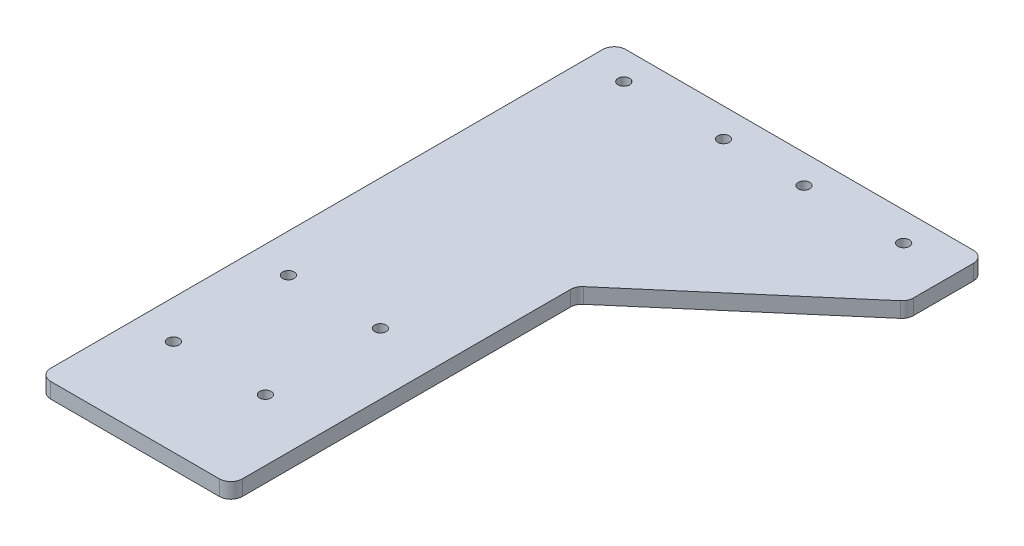
ISO-10303-21;
HEADER;
FILE_DESCRIPTION(('STEP AP214'),'2;1');
FILE_NAME('part.step','',(''),(''),'','','');
FILE_SCHEMA(('AUTOMOTIVE_DESIGN { 1 0 10303 214 1 1 1 1 }'));
ENDSEC;
DATA;
#1=APPLICATION_CONTEXT('core data for automotive mechanical design processes');
#2=APPLICATION_PROTOCOL_DEFINITION('international standard','automotive_design',2000,#1);
#3=PRODUCT_CONTEXT('',#1,'mechanical');
#4=PRODUCT('Part','Part','',(#3));
#5=PRODUCT_RELATED_PRODUCT_CATEGORY('part','',(#4));
#6=PRODUCT_DEFINITION_FORMATION('','',#4);
#7=PRODUCT_DEFINITION_CONTEXT('part definition',#1,'design');
#8=PRODUCT_DEFINITION('design','',#6,#7);
#9=PRODUCT_DEFINITION_SHAPE('','',#8);
#10=(LENGTH_UNIT() NAMED_UNIT(*) SI_UNIT(.MILLI.,.METRE.));
#11=(NAMED_UNIT(*) PLANE_ANGLE_UNIT() SI_UNIT($,.RADIAN.));
#12=(NAMED_UNIT(*) SI_UNIT($,.STERADIAN.) SOLID_ANGLE_UNIT());
#13=UNCERTAINTY_MEASURE_WITH_UNIT(LENGTH_MEASURE(1.E-05),#10,'distance_accuracy_value','');
#14=(GEOMETRIC_REPRESENTATION_CONTEXT(3) GLOBAL_UNCERTAINTY_ASSIGNED_CONTEXT((#13)) GLOBAL_UNIT_ASSIGNED_CONTEXT((#10,
#11,#12)) REPRESENTATION_CONTEXT('',''));
#15=CARTESIAN_POINT('',(0.,0.,0.));
#16=DIRECTION('',(0.,0.,1.));
#17=DIRECTION('',(1.,0.,0.));
#18=AXIS2_PLACEMENT_3D('',#15,#16,#17);
#19=CARTESIAN_POINT('',(0.,4.,0.));
#20=DIRECTION('',(1.,0.,0.));
#21=DIRECTION('',(0.,0.,-1.));
#22=AXIS2_PLACEMENT_3D('',#19,#20,#21);
#23=PLANE('',#22);
#24=DIRECTION('',(0.,0.,1.));
#25=VECTOR('',#24,1.);
#26=CARTESIAN_POINT('',(0.,4.,0.));
#27=LINE('',#26,#25);
#28=CARTESIAN_POINT('',(0.,4.,-147.));
#29=VERTEX_POINT('',#28);
#30=CARTESIAN_POINT('',(0.,4.,-3.));
#31=VERTEX_POINT('',#30);
#32=EDGE_CURVE('E222',#29,#31,#27,.T.);
#33=ORIENTED_EDGE('',*,*,#32,.F.);
#34=DIRECTION('',(0.,-1.,0.));
#35=VECTOR('',#34,1.);
#36=CARTESIAN_POINT('',(0.,4.,-147.));
#37=LINE('',#36,#35);
#38=CARTESIAN_POINT('',(0.,0.,-147.));
#39=VERTEX_POINT('',#38);
#40=EDGE_CURVE('E169',#29,#39,#37,.T.);
#41=ORIENTED_EDGE('',*,*,#40,.T.);
#42=DIRECTION('',(0.,0.,1.));
#43=VECTOR('',#42,1.);
#44=CARTESIAN_POINT('',(0.,0.,0.));
#45=LINE('',#44,#43);
#46=CARTESIAN_POINT('',(0.,0.,-3.));
#47=VERTEX_POINT('',#46);
#48=EDGE_CURVE('E228',#39,#47,#45,.T.);
#49=ORIENTED_EDGE('',*,*,#48,.T.);
#50=DIRECTION('',(0.,-1.,0.));
#51=VECTOR('',#50,1.);
#52=CARTESIAN_POINT('',(0.,4.,-3.));
#53=LINE('',#52,#51);
#54=EDGE_CURVE('E167',#47,#31,#53,.F.);
#55=ORIENTED_EDGE('',*,*,#54,.T.);
#56=EDGE_LOOP('',(#33,#41,#49,#55));
#57=FACE_BOUND('',#56,.T.);
#58=ADVANCED_FACE('F35',(#57),#23,.F.);
#59=CARTESIAN_POINT('',(0.,4.,0.));
#60=DIRECTION('',(0.,0.,-1.));
#61=DIRECTION('',(-1.,0.,0.));
#62=AXIS2_PLACEMENT_3D('',#59,#60,#61);
#63=PLANE('',#62);
#64=DIRECTION('',(1.,0.,0.));
#65=VECTOR('',#64,1.);
#66=CARTESIAN_POINT('',(0.,4.,0.));
#67=LINE('',#66,#65);
#68=CARTESIAN_POINT('',(3.,4.,0.));
#69=VERTEX_POINT('',#68);
#70=CARTESIAN_POINT('',(47.,4.,0.));
#71=VERTEX_POINT('',#70);
#72=EDGE_CURVE('E226',#69,#71,#67,.T.);
#73=ORIENTED_EDGE('',*,*,#72,.F.);
#74=DIRECTION('',(0.,-1.,0.));
#75=VECTOR('',#74,1.);
#76=CARTESIAN_POINT('',(3.,4.,0.));
#77=LINE('',#76,#75);
#78=CARTESIAN_POINT('',(3.,0.,0.));
#79=VERTEX_POINT('',#78);
#80=EDGE_CURVE('E173',#69,#79,#77,.T.);
#81=ORIENTED_EDGE('',*,*,#80,.T.);
#82=DIRECTION('',(1.,0.,0.));
#83=VECTOR('',#82,1.);
#84=CARTESIAN_POINT('',(0.,0.,0.));
#85=LINE('',#84,#83);
#86=CARTESIAN_POINT('',(47.,0.,0.));
#87=VERTEX_POINT('',#86);
#88=EDGE_CURVE('E223',#79,#87,#85,.T.);
#89=ORIENTED_EDGE('',*,*,#88,.T.);
#90=DIRECTION('',(0.,1.,0.));
#91=VECTOR('',#90,1.);
#92=CARTESIAN_POINT('',(47.,4.,0.));
#93=LINE('',#92,#91);
#94=EDGE_CURVE('E150',#87,#71,#93,.T.);
#95=ORIENTED_EDGE('',*,*,#94,.T.);
#96=EDGE_LOOP('',(#73,#81,#89,#95));
#97=FACE_BOUND('',#96,.T.);
#98=ADVANCED_FACE('F299',(#97),#63,.F.);
#99=CARTESIAN_POINT('',(0.,4.,-150.));
#100=DIRECTION('',(0.,0.,1.));
#101=DIRECTION('',(1.,0.,0.));
#102=AXIS2_PLACEMENT_3D('',#99,#100,#101);
#103=PLANE('',#102);
#104=DIRECTION('',(-1.,0.,0.));
#105=VECTOR('',#104,1.);
#106=CARTESIAN_POINT('',(0.,4.,-150.));
#107=LINE('',#106,#105);
#108=CARTESIAN_POINT('',(93.6666666666667,4.,-150.));
#109=VERTEX_POINT('',#108);
#110=CARTESIAN_POINT('',(3.,4.,-150.));
#111=VERTEX_POINT('',#110);
#112=EDGE_CURVE('E146',#109,#111,#107,.T.);
#113=ORIENTED_EDGE('',*,*,#112,.F.);
#114=DIRECTION('',(0.,-1.,0.));
#115=VECTOR('',#114,1.);
#116=CARTESIAN_POINT('',(93.6666666666667,4.,-150.));
#117=LINE('',#116,#115);
#118=CARTESIAN_POINT('',(93.6666666666667,0.,-150.));
#119=VERTEX_POINT('',#118);
#120=EDGE_CURVE('E165',#109,#119,#117,.T.);
#121=ORIENTED_EDGE('',*,*,#120,.T.);
#122=DIRECTION('',(-1.,0.,0.));
#123=VECTOR('',#122,1.);
#124=CARTESIAN_POINT('',(0.,0.,-150.));
#125=LINE('',#124,#123);
#126=CARTESIAN_POINT('',(3.,0.,-150.));
#127=VERTEX_POINT('',#126);
#128=EDGE_CURVE('E220',#119,#127,#125,.T.);
#129=ORIENTED_EDGE('',*,*,#128,.T.);
#130=DIRECTION('',(0.,-1.,0.));
#131=VECTOR('',#130,1.);
#132=CARTESIAN_POINT('',(3.,4.,-150.));
#133=LINE('',#132,#131);
#134=EDGE_CURVE('E163',#127,#111,#133,.F.);
#135=ORIENTED_EDGE('',*,*,#134,.T.);
#136=EDGE_LOOP('',(#113,#121,#129,#135));
#137=FACE_BOUND('',#136,.T.);
#138=ADVANCED_FACE('F219',(#137),#103,.F.);
#139=CARTESIAN_POINT('',(0.,4.,0.));
#140=DIRECTION('',(0.,-1.,0.));
#141=DIRECTION('',(0.,0.,-1.));
#142=AXIS2_PLACEMENT_3D('',#139,#140,#141);
#143=PLANE('',#142);
#144=CARTESIAN_POINT('',(36.,4.,-142.5));
#145=DIRECTION('',(0.,1.,0.));
#146=DIRECTION('',(0.,0.,1.));
#147=AXIS2_PLACEMENT_3D('',#144,#145,#146);
#148=CIRCLE('',#147,1.5);
#149=CARTESIAN_POINT('',(36.,4.,-141.));
#150=VERTEX_POINT('',#149);
#151=EDGE_CURVE('E279',#150,#150,#148,.T.);
#152=ORIENTED_EDGE('',*,*,#151,.F.);
#153=EDGE_LOOP('',(#152));
#154=FACE_BOUND('',#153,.T.);
#155=CARTESIAN_POINT('',(57.,4.,-142.5));
#156=DIRECTION('',(0.,1.,0.));
#157=DIRECTION('',(0.,0.,1.));
#158=AXIS2_PLACEMENT_3D('',#155,#156,#157);
#159=CIRCLE('',#158,1.5);
#160=CARTESIAN_POINT('',(57.,4.,-141.));
#161=VERTEX_POINT('',#160);
#162=EDGE_CURVE('E273',#161,#161,#159,.T.);
#163=ORIENTED_EDGE('',*,*,#162,.F.);
#164=EDGE_LOOP('',(#163));
#165=FACE_BOUND('',#164,.T.);
#166=CARTESIAN_POINT('',(83.,4.,-142.5));
#167=DIRECTION('',(0.,1.,0.));
#168=DIRECTION('',(0.,0.,1.));
#169=AXIS2_PLACEMENT_3D('',#166,#167,#168);
#170=CIRCLE('',#169,1.5);
#171=CARTESIAN_POINT('',(83.,4.,-141.));
#172=VERTEX_POINT('',#171);
#173=EDGE_CURVE('E267',#172,#172,#170,.T.);
#174=ORIENTED_EDGE('',*,*,#173,.F.);
#175=EDGE_LOOP('',(#174));
#176=FACE_BOUND('',#175,.T.);
#177=CARTESIAN_POINT('',(9.99999999999999,4.,-142.5));
#178=DIRECTION('',(0.,1.,0.));
#179=DIRECTION('',(0.,0.,1.));
#180=AXIS2_PLACEMENT_3D('',#177,#178,#179);
#181=CIRCLE('',#180,1.5);
#182=CARTESIAN_POINT('',(9.99999999999999,4.,-141.));
#183=VERTEX_POINT('',#182);
#184=EDGE_CURVE('E261',#183,#183,#181,.T.);
#185=ORIENTED_EDGE('',*,*,#184,.F.);
#186=EDGE_LOOP('',(#185));
#187=FACE_BOUND('',#186,.T.);
#188=CARTESIAN_POINT('',(34.,4.,-25.));
#189=DIRECTION('',(0.,1.,0.));
#190=DIRECTION('',(0.,0.,1.));
#191=AXIS2_PLACEMENT_3D('',#188,#189,#190);
#192=CIRCLE('',#191,1.5);
#193=CARTESIAN_POINT('',(34.,4.,-23.5));
#194=VERTEX_POINT('',#193);
#195=EDGE_CURVE('E256',#194,#194,#192,.T.);
#196=ORIENTED_EDGE('',*,*,#195,.F.);
#197=EDGE_LOOP('',(#196));
#198=FACE_BOUND('',#197,.T.);
#199=CARTESIAN_POINT('',(33.9999999999999,4.,-55.));
#200=DIRECTION('',(0.,1.,0.));
#201=DIRECTION('',(0.,0.,1.));
#202=AXIS2_PLACEMENT_3D('',#199,#200,#201);
#203=CIRCLE('',#202,1.5);
#204=CARTESIAN_POINT('',(33.9999999999999,4.,-53.5));
#205=VERTEX_POINT('',#204);
#206=EDGE_CURVE('E250',#205,#205,#203,.T.);
#207=ORIENTED_EDGE('',*,*,#206,.F.);
#208=EDGE_LOOP('',(#207));
#209=FACE_BOUND('',#208,.T.);
#210=CARTESIAN_POINT('',(9.9999999999999,4.,-55.));
#211=DIRECTION('',(0.,1.,0.));
#212=DIRECTION('',(0.,0.,1.));
#213=AXIS2_PLACEMENT_3D('',#210,#211,#212);
#214=CIRCLE('',#213,1.5);
#215=CARTESIAN_POINT('',(9.9999999999999,4.,-53.5));
#216=VERTEX_POINT('',#215);
#217=EDGE_CURVE('E243',#216,#216,#214,.T.);
#218=ORIENTED_EDGE('',*,*,#217,.F.);
#219=EDGE_LOOP('',(#218));
#220=FACE_BOUND('',#219,.T.);
#221=CARTESIAN_POINT('',(10.,4.,-25.));
#222=DIRECTION('',(0.,1.,0.));
#223=DIRECTION('',(0.,0.,1.));
#224=AXIS2_PLACEMENT_3D('',#221,#222,#223);
#225=CIRCLE('',#224,1.5);
#226=CARTESIAN_POINT('',(10.,4.,-23.5));
#227=VERTEX_POINT('',#226);
#228=EDGE_CURVE('E237',#227,#227,#225,.T.);
#229=ORIENTED_EDGE('',*,*,#228,.F.);
#230=EDGE_LOOP('',(#229));
#231=FACE_BOUND('',#230,.T.);
#232=DIRECTION('',(-0.759256602365297,0.,0.650791373455969));
#233=VECTOR('',#232,1.);
#234=CARTESIAN_POINT('',(50.,4.,-90.));
#235=LINE('',#234,#233);
#236=CARTESIAN_POINT('',(95.6190407870346,4.,-129.102034960315));
#237=VERTEX_POINT('',#236);
#238=CARTESIAN_POINT('',(51.0476258796321,4.,-90.8979650396846));
#239=VERTEX_POINT('',#238);
#240=EDGE_CURVE('E179',#237,#239,#235,.T.);
#241=ORIENTED_EDGE('',*,*,#240,.F.);
#242=CARTESIAN_POINT('',(93.6666666666667,4.,-131.379804767411));
#243=DIRECTION('',(0.,-1.,0.));
#244=DIRECTION('',(0.,0.,-1.));
#245=AXIS2_PLACEMENT_3D('',#242,#243,#244);
#246=CIRCLE('',#245,3.);
#247=CARTESIAN_POINT('',(96.6666666666667,4.,-131.379804767411));
#248=VERTEX_POINT('',#247);
#249=EDGE_CURVE('E205',#237,#248,#246,.F.);
#250=ORIENTED_EDGE('',*,*,#249,.T.);
#251=DIRECTION('',(0.,0.,1.));
#252=VECTOR('',#251,1.);
#253=CARTESIAN_POINT('',(96.6666666666667,4.,-130.));
#254=LINE('',#253,#252);
#255=CARTESIAN_POINT('',(96.6666666666667,4.,-147.));
#256=VERTEX_POINT('',#255);
#257=EDGE_CURVE('E211',#256,#248,#254,.T.);
#258=ORIENTED_EDGE('',*,*,#257,.F.);
#259=CARTESIAN_POINT('',(93.6666666666667,4.,-147.));
#260=DIRECTION('',(0.,-1.,0.));
#261=DIRECTION('',(0.,0.,-1.));
#262=AXIS2_PLACEMENT_3D('',#259,#260,#261);
#263=CIRCLE('',#262,3.);
#264=EDGE_CURVE('E203',#256,#109,#263,.F.);
#265=ORIENTED_EDGE('',*,*,#264,.T.);
#266=ORIENTED_EDGE('',*,*,#112,.T.);
#267=CARTESIAN_POINT('',(3.,4.,-147.));
#268=DIRECTION('',(0.,-1.,0.));
#269=DIRECTION('',(0.,0.,-1.));
#270=AXIS2_PLACEMENT_3D('',#267,#268,#269);
#271=CIRCLE('',#270,3.);
#272=EDGE_CURVE('E201',#111,#29,#271,.F.);
#273=ORIENTED_EDGE('',*,*,#272,.T.);
#274=ORIENTED_EDGE('',*,*,#32,.T.);
#275=CARTESIAN_POINT('',(3.,4.,-3.));
#276=DIRECTION('',(0.,-1.,0.));
#277=DIRECTION('',(0.,0.,-1.));
#278=AXIS2_PLACEMENT_3D('',#275,#276,#277);
#279=CIRCLE('',#278,3.);
#280=EDGE_CURVE('E195',#31,#69,#279,.F.);
#281=ORIENTED_EDGE('',*,*,#280,.T.);
#282=ORIENTED_EDGE('',*,*,#72,.T.);
#283=CARTESIAN_POINT('',(47.,4.,-3.));
#284=DIRECTION('',(0.,-1.,0.));
#285=DIRECTION('',(0.,0.,-1.));
#286=AXIS2_PLACEMENT_3D('',#283,#284,#285);
#287=CIRCLE('',#286,3.);
#288=CARTESIAN_POINT('',(50.,4.,-3.));
#289=VERTEX_POINT('',#288);
#290=EDGE_CURVE('E193',#71,#289,#287,.F.);
#291=ORIENTED_EDGE('',*,*,#290,.T.);
#292=DIRECTION('',(0.,0.,1.));
#293=VECTOR('',#292,1.);
#294=CARTESIAN_POINT('',(50.,4.,0.));
#295=LINE('',#294,#293);
#296=CARTESIAN_POINT('',(50.,4.,-88.6201952325887));
#297=VERTEX_POINT('',#296);
#298=EDGE_CURVE('E133',#297,#289,#295,.T.);
#299=ORIENTED_EDGE('',*,*,#298,.F.);
#300=CARTESIAN_POINT('',(53.,4.,-88.6201952325888));
#301=DIRECTION('',(0.,-1.,0.));
#302=DIRECTION('',(0.,0.,-1.));
#303=AXIS2_PLACEMENT_3D('',#300,#301,#302);
#304=CIRCLE('',#303,3.);
#305=EDGE_CURVE('E43',#297,#239,#304,.T.);
#306=ORIENTED_EDGE('',*,*,#305,.T.);
#307=EDGE_LOOP('',(#241,#250,#258,#265,#266,#273,#274,#281,#282,#291,#299,#306));
#308=FACE_BOUND('',#307,.T.);
#309=ADVANCED_FACE('F178',(#154,#165,#176,#187,#198,#209,#220,#231,#308),#143,.F.);
#310=CARTESIAN_POINT('',(0.,0.,0.));
#311=DIRECTION('',(0.,-1.,0.));
#312=DIRECTION('',(0.,0.,-1.));
#313=AXIS2_PLACEMENT_3D('',#310,#311,#312);
#314=PLANE('',#313);
#315=DIRECTION('',(0.,0.,-1.));
#316=VECTOR('',#315,1.);
#317=CARTESIAN_POINT('',(96.6666666666667,0.,0.));
#318=LINE('',#317,#316);
#319=CARTESIAN_POINT('',(96.6666666666667,0.,-131.379804767411));
#320=VERTEX_POINT('',#319);
#321=CARTESIAN_POINT('',(96.6666666666667,0.,-147.));
#322=VERTEX_POINT('',#321);
#323=EDGE_CURVE('E190',#320,#322,#318,.T.);
#324=ORIENTED_EDGE('',*,*,#323,.F.);
#325=CARTESIAN_POINT('',(93.6666666666667,0.,-131.379804767411));
#326=DIRECTION('',(0.,-1.,0.));
#327=DIRECTION('',(0.,0.,-1.));
#328=AXIS2_PLACEMENT_3D('',#325,#326,#327);
#329=CIRCLE('',#328,3.);
#330=CARTESIAN_POINT('',(95.6190407870346,0.,-129.102034960315));
#331=VERTEX_POINT('',#330);
#332=EDGE_CURVE('E161',#320,#331,#329,.T.);
#333=ORIENTED_EDGE('',*,*,#332,.T.);
#334=DIRECTION('',(0.759256602365297,0.,-0.650791373455969));
#335=VECTOR('',#334,1.);
#336=CARTESIAN_POINT('',(-23.2941176470588,0.,-27.1764705882353));
#337=LINE('',#336,#335);
#338=CARTESIAN_POINT('',(51.0476258796321,0.,-90.8979650396846));
#339=VERTEX_POINT('',#338);
#340=EDGE_CURVE('E189',#339,#331,#337,.T.);
#341=ORIENTED_EDGE('',*,*,#340,.F.);
#342=CARTESIAN_POINT('',(53.,0.,-88.6201952325888));
#343=DIRECTION('',(0.,-1.,0.));
#344=DIRECTION('',(0.,0.,-1.));
#345=AXIS2_PLACEMENT_3D('',#342,#343,#344);
#346=CIRCLE('',#345,3.);
#347=CARTESIAN_POINT('',(50.,0.,-88.6201952325888));
#348=VERTEX_POINT('',#347);
#349=EDGE_CURVE('E11',#339,#348,#346,.F.);
#350=ORIENTED_EDGE('',*,*,#349,.T.);
#351=DIRECTION('',(0.,0.,-1.));
#352=VECTOR('',#351,1.);
#353=CARTESIAN_POINT('',(50.,0.,0.));
#354=LINE('',#353,#352);
#355=CARTESIAN_POINT('',(50.,0.,-3.));
#356=VERTEX_POINT('',#355);
#357=EDGE_CURVE('E130',#356,#348,#354,.T.);
#358=ORIENTED_EDGE('',*,*,#357,.F.);
#359=CARTESIAN_POINT('',(47.,0.,-3.));
#360=DIRECTION('',(0.,-1.,0.));
#361=DIRECTION('',(0.,0.,-1.));
#362=AXIS2_PLACEMENT_3D('',#359,#360,#361);
#363=CIRCLE('',#362,3.);
#364=EDGE_CURVE('E142',#356,#87,#363,.T.);
#365=ORIENTED_EDGE('',*,*,#364,.T.);
#366=ORIENTED_EDGE('',*,*,#88,.F.);
#367=CARTESIAN_POINT('',(3.,0.,-3.));
#368=DIRECTION('',(0.,-1.,0.));
#369=DIRECTION('',(0.,0.,-1.));
#370=AXIS2_PLACEMENT_3D('',#367,#368,#369);
#371=CIRCLE('',#370,3.);
#372=EDGE_CURVE('E151',#79,#47,#371,.T.);
#373=ORIENTED_EDGE('',*,*,#372,.T.);
#374=ORIENTED_EDGE('',*,*,#48,.F.);
#375=CARTESIAN_POINT('',(3.,0.,-147.));
#376=DIRECTION('',(0.,-1.,0.));
#377=DIRECTION('',(0.,0.,-1.));
#378=AXIS2_PLACEMENT_3D('',#375,#376,#377);
#379=CIRCLE('',#378,3.);
#380=EDGE_CURVE('E50',#39,#127,#379,.T.);
#381=ORIENTED_EDGE('',*,*,#380,.T.);
#382=ORIENTED_EDGE('',*,*,#128,.F.);
#383=CARTESIAN_POINT('',(93.6666666666667,0.,-147.));
#384=DIRECTION('',(0.,-1.,0.));
#385=DIRECTION('',(0.,0.,-1.));
#386=AXIS2_PLACEMENT_3D('',#383,#384,#385);
#387=CIRCLE('',#386,3.);
#388=EDGE_CURVE('E58',#119,#322,#387,.T.);
#389=ORIENTED_EDGE('',*,*,#388,.T.);
#390=EDGE_LOOP('',(#324,#333,#341,#350,#358,#365,#366,#373,#374,#381,#382,#389));
#391=FACE_BOUND('',#390,.T.);
#392=CARTESIAN_POINT('',(36.,0.,-142.5));
#393=DIRECTION('',(0.,1.,0.));
#394=DIRECTION('',(0.,0.,1.));
#395=AXIS2_PLACEMENT_3D('',#392,#393,#394);
#396=CIRCLE('',#395,1.5);
#397=CARTESIAN_POINT('',(36.,0.,-141.));
#398=VERTEX_POINT('',#397);
#399=EDGE_CURVE('E264',#398,#398,#396,.T.);
#400=ORIENTED_EDGE('',*,*,#399,.T.);
#401=EDGE_LOOP('',(#400));
#402=FACE_BOUND('',#401,.T.);
#403=CARTESIAN_POINT('',(57.,0.,-142.5));
#404=DIRECTION('',(0.,1.,0.));
#405=DIRECTION('',(0.,0.,1.));
#406=AXIS2_PLACEMENT_3D('',#403,#404,#405);
#407=CIRCLE('',#406,1.5);
#408=CARTESIAN_POINT('',(57.,0.,-141.));
#409=VERTEX_POINT('',#408);
#410=EDGE_CURVE('E276',#409,#409,#407,.T.);
#411=ORIENTED_EDGE('',*,*,#410,.T.);
#412=EDGE_LOOP('',(#411));
#413=FACE_BOUND('',#412,.T.);
#414=CARTESIAN_POINT('',(83.,0.,-142.5));
#415=DIRECTION('',(0.,1.,0.));
#416=DIRECTION('',(0.,0.,1.));
#417=AXIS2_PLACEMENT_3D('',#414,#415,#416);
#418=CIRCLE('',#417,1.5);
#419=CARTESIAN_POINT('',(83.,0.,-141.));
#420=VERTEX_POINT('',#419);
#421=EDGE_CURVE('E270',#420,#420,#418,.T.);
#422=ORIENTED_EDGE('',*,*,#421,.T.);
#423=EDGE_LOOP('',(#422));
#424=FACE_BOUND('',#423,.T.);
#425=CARTESIAN_POINT('',(9.99999999999999,0.,-142.5));
#426=DIRECTION('',(0.,1.,0.));
#427=DIRECTION('',(0.,0.,1.));
#428=AXIS2_PLACEMENT_3D('',#425,#426,#427);
#429=CIRCLE('',#428,1.5);
#430=CARTESIAN_POINT('',(9.99999999999999,0.,-141.));
#431=VERTEX_POINT('',#430);
#432=EDGE_CURVE('E247',#431,#431,#429,.T.);
#433=ORIENTED_EDGE('',*,*,#432,.T.);
#434=EDGE_LOOP('',(#433));
#435=FACE_BOUND('',#434,.T.);
#436=CARTESIAN_POINT('',(34.,0.,-25.));
#437=DIRECTION('',(0.,1.,0.));
#438=DIRECTION('',(0.,0.,1.));
#439=AXIS2_PLACEMENT_3D('',#436,#437,#438);
#440=CIRCLE('',#439,1.5);
#441=CARTESIAN_POINT('',(34.,0.,-23.5));
#442=VERTEX_POINT('',#441);
#443=EDGE_CURVE('E240',#442,#442,#440,.T.);
#444=ORIENTED_EDGE('',*,*,#443,.T.);
#445=EDGE_LOOP('',(#444));
#446=FACE_BOUND('',#445,.T.);
#447=CARTESIAN_POINT('',(33.9999999999999,0.,-55.));
#448=DIRECTION('',(0.,1.,0.));
#449=DIRECTION('',(0.,0.,1.));
#450=AXIS2_PLACEMENT_3D('',#447,#448,#449);
#451=CIRCLE('',#450,1.5);
#452=CARTESIAN_POINT('',(33.9999999999999,0.,-53.5));
#453=VERTEX_POINT('',#452);
#454=EDGE_CURVE('E253',#453,#453,#451,.T.);
#455=ORIENTED_EDGE('',*,*,#454,.T.);
#456=EDGE_LOOP('',(#455));
#457=FACE_BOUND('',#456,.T.);
#458=CARTESIAN_POINT('',(9.9999999999999,0.,-55.));
#459=DIRECTION('',(0.,1.,0.));
#460=DIRECTION('',(0.,0.,1.));
#461=AXIS2_PLACEMENT_3D('',#458,#459,#460);
#462=CIRCLE('',#461,1.5);
#463=CARTESIAN_POINT('',(9.9999999999999,0.,-53.5));
#464=VERTEX_POINT('',#463);
#465=EDGE_CURVE('E246',#464,#464,#462,.T.);
#466=ORIENTED_EDGE('',*,*,#465,.T.);
#467=EDGE_LOOP('',(#466));
#468=FACE_BOUND('',#467,.T.);
#469=CARTESIAN_POINT('',(10.,0.,-25.));
#470=DIRECTION('',(0.,1.,0.));
#471=DIRECTION('',(0.,0.,1.));
#472=AXIS2_PLACEMENT_3D('',#469,#470,#471);
#473=CIRCLE('',#472,1.5);
#474=CARTESIAN_POINT('',(10.,0.,-23.5));
#475=VERTEX_POINT('',#474);
#476=EDGE_CURVE('E233',#475,#475,#473,.T.);
#477=ORIENTED_EDGE('',*,*,#476,.T.);
#478=EDGE_LOOP('',(#477));
#479=FACE_BOUND('',#478,.T.);
#480=ADVANCED_FACE('F139',(#391,#402,#413,#424,#435,#446,#457,#468,#479),#314,.T.);
#481=CARTESIAN_POINT('',(10.,0.,-25.));
#482=DIRECTION('',(0.,1.,0.));
#483=DIRECTION('',(0.,0.,1.));
#484=AXIS2_PLACEMENT_3D('',#481,#482,#483);
#485=CYLINDRICAL_SURFACE('',#484,1.5);
#486=ORIENTED_EDGE('',*,*,#476,.F.);
#487=EDGE_LOOP('',(#486));
#488=FACE_BOUND('',#487,.T.);
#489=ORIENTED_EDGE('',*,*,#228,.T.);
#490=EDGE_LOOP('',(#489));
#491=FACE_BOUND('',#490,.T.);
#492=ADVANCED_FACE('F313',(#488,#491),#485,.F.);
#493=CARTESIAN_POINT('',(9.9999999999999,0.,-55.));
#494=DIRECTION('',(0.,1.,0.));
#495=DIRECTION('',(0.,0.,1.));
#496=AXIS2_PLACEMENT_3D('',#493,#494,#495);
#497=CYLINDRICAL_SURFACE('',#496,1.5);
#498=ORIENTED_EDGE('',*,*,#465,.F.);
#499=EDGE_LOOP('',(#498));
#500=FACE_BOUND('',#499,.T.);
#501=ORIENTED_EDGE('',*,*,#217,.T.);
#502=EDGE_LOOP('',(#501));
#503=FACE_BOUND('',#502,.T.);
#504=ADVANCED_FACE('F319',(#500,#503),#497,.F.);
#505=CARTESIAN_POINT('',(33.9999999999999,0.,-55.));
#506=DIRECTION('',(0.,1.,0.));
#507=DIRECTION('',(0.,0.,1.));
#508=AXIS2_PLACEMENT_3D('',#505,#506,#507);
#509=CYLINDRICAL_SURFACE('',#508,1.5);
#510=ORIENTED_EDGE('',*,*,#454,.F.);
#511=EDGE_LOOP('',(#510));
#512=FACE_BOUND('',#511,.T.);
#513=ORIENTED_EDGE('',*,*,#206,.T.);
#514=EDGE_LOOP('',(#513));
#515=FACE_BOUND('',#514,.T.);
#516=ADVANCED_FACE('F323',(#512,#515),#509,.F.);
#517=CARTESIAN_POINT('',(34.,0.,-25.));
#518=DIRECTION('',(0.,1.,0.));
#519=DIRECTION('',(0.,0.,1.));
#520=AXIS2_PLACEMENT_3D('',#517,#518,#519);
#521=CYLINDRICAL_SURFACE('',#520,1.5);
#522=ORIENTED_EDGE('',*,*,#443,.F.);
#523=EDGE_LOOP('',(#522));
#524=FACE_BOUND('',#523,.T.);
#525=ORIENTED_EDGE('',*,*,#195,.T.);
#526=EDGE_LOOP('',(#525));
#527=FACE_BOUND('',#526,.T.);
#528=ADVANCED_FACE('F327',(#524,#527),#521,.F.);
#529=CARTESIAN_POINT('',(9.99999999999999,0.,-142.5));
#530=DIRECTION('',(0.,1.,0.));
#531=DIRECTION('',(0.,0.,1.));
#532=AXIS2_PLACEMENT_3D('',#529,#530,#531);
#533=CYLINDRICAL_SURFACE('',#532,1.5);
#534=ORIENTED_EDGE('',*,*,#432,.F.);
#535=EDGE_LOOP('',(#534));
#536=FACE_BOUND('',#535,.T.);
#537=ORIENTED_EDGE('',*,*,#184,.T.);
#538=EDGE_LOOP('',(#537));
#539=FACE_BOUND('',#538,.T.);
#540=ADVANCED_FACE('F331',(#536,#539),#533,.F.);
#541=CARTESIAN_POINT('',(83.,0.,-142.5));
#542=DIRECTION('',(0.,1.,0.));
#543=DIRECTION('',(0.,0.,1.));
#544=AXIS2_PLACEMENT_3D('',#541,#542,#543);
#545=CYLINDRICAL_SURFACE('',#544,1.5);
#546=ORIENTED_EDGE('',*,*,#421,.F.);
#547=EDGE_LOOP('',(#546));
#548=FACE_BOUND('',#547,.T.);
#549=ORIENTED_EDGE('',*,*,#173,.T.);
#550=EDGE_LOOP('',(#549));
#551=FACE_BOUND('',#550,.T.);
#552=ADVANCED_FACE('F335',(#548,#551),#545,.F.);
#553=CARTESIAN_POINT('',(57.,0.,-142.5));
#554=DIRECTION('',(0.,1.,0.));
#555=DIRECTION('',(0.,0.,1.));
#556=AXIS2_PLACEMENT_3D('',#553,#554,#555);
#557=CYLINDRICAL_SURFACE('',#556,1.5);
#558=ORIENTED_EDGE('',*,*,#410,.F.);
#559=EDGE_LOOP('',(#558));
#560=FACE_BOUND('',#559,.T.);
#561=ORIENTED_EDGE('',*,*,#162,.T.);
#562=EDGE_LOOP('',(#561));
#563=FACE_BOUND('',#562,.T.);
#564=ADVANCED_FACE('F339',(#560,#563),#557,.F.);
#565=CARTESIAN_POINT('',(36.,0.,-142.5));
#566=DIRECTION('',(0.,1.,0.));
#567=DIRECTION('',(0.,0.,1.));
#568=AXIS2_PLACEMENT_3D('',#565,#566,#567);
#569=CYLINDRICAL_SURFACE('',#568,1.5);
#570=ORIENTED_EDGE('',*,*,#399,.F.);
#571=EDGE_LOOP('',(#570));
#572=FACE_BOUND('',#571,.T.);
#573=ORIENTED_EDGE('',*,*,#151,.T.);
#574=EDGE_LOOP('',(#573));
#575=FACE_BOUND('',#574,.T.);
#576=ADVANCED_FACE('F343',(#572,#575),#569,.F.);
#577=CARTESIAN_POINT('',(50.,-6.,0.));
#578=DIRECTION('',(-1.,0.,0.));
#579=DIRECTION('',(0.,0.,1.));
#580=AXIS2_PLACEMENT_3D('',#577,#578,#579);
#581=PLANE('',#580);
#582=ORIENTED_EDGE('',*,*,#357,.T.);
#583=DIRECTION('',(0.,1.,0.));
#584=VECTOR('',#583,1.);
#585=CARTESIAN_POINT('',(50.,4.,-88.6201952325888));
#586=LINE('',#585,#584);
#587=EDGE_CURVE('E136',#348,#297,#586,.T.);
#588=ORIENTED_EDGE('',*,*,#587,.T.);
#589=ORIENTED_EDGE('',*,*,#298,.T.);
#590=DIRECTION('',(0.,1.,0.));
#591=VECTOR('',#590,1.);
#592=CARTESIAN_POINT('',(50.,-6.,-3.));
#593=LINE('',#592,#591);
#594=EDGE_CURVE('E126',#289,#356,#593,.F.);
#595=ORIENTED_EDGE('',*,*,#594,.T.);
#596=EDGE_LOOP('',(#582,#588,#589,#595));
#597=FACE_BOUND('',#596,.T.);
#598=ADVANCED_FACE('F128',(#597),#581,.F.);
#599=CARTESIAN_POINT('',(50.,-6.,-90.));
#600=DIRECTION('',(-0.650791373455969,0.,-0.759256602365297));
#601=DIRECTION('',(-0.759256602365297,0.,0.650791373455969));
#602=AXIS2_PLACEMENT_3D('',#599,#600,#601);
#603=PLANE('',#602);
#604=ORIENTED_EDGE('',*,*,#240,.T.);
#605=DIRECTION('',(0.,1.,0.));
#606=VECTOR('',#605,1.);
#607=CARTESIAN_POINT('',(51.0476258796321,0.,-90.8979650396846));
#608=LINE('',#607,#606);
#609=EDGE_CURVE('E186',#239,#339,#608,.F.);
#610=ORIENTED_EDGE('',*,*,#609,.T.);
#611=ORIENTED_EDGE('',*,*,#340,.T.);
#612=DIRECTION('',(0.,1.,0.));
#613=VECTOR('',#612,1.);
#614=CARTESIAN_POINT('',(95.6190407870346,-6.,-129.102034960315));
#615=LINE('',#614,#613);
#616=EDGE_CURVE('E188',#331,#237,#615,.T.);
#617=ORIENTED_EDGE('',*,*,#616,.T.);
#618=EDGE_LOOP('',(#604,#610,#611,#617));
#619=FACE_BOUND('',#618,.T.);
#620=ADVANCED_FACE('F184',(#619),#603,.F.);
#621=CARTESIAN_POINT('',(96.6666666666667,-6.,-130.));
#622=DIRECTION('',(-1.,0.,0.));
#623=DIRECTION('',(0.,0.,1.));
#624=AXIS2_PLACEMENT_3D('',#621,#622,#623);
#625=PLANE('',#624);
#626=ORIENTED_EDGE('',*,*,#257,.T.);
#627=DIRECTION('',(0.,1.,0.));
#628=VECTOR('',#627,1.);
#629=CARTESIAN_POINT('',(96.6666666666667,-6.,-131.379804767411));
#630=LINE('',#629,#628);
#631=EDGE_CURVE('E152',#248,#320,#630,.F.);
#632=ORIENTED_EDGE('',*,*,#631,.T.);
#633=ORIENTED_EDGE('',*,*,#323,.T.);
#634=DIRECTION('',(0.,-1.,0.));
#635=VECTOR('',#634,1.);
#636=CARTESIAN_POINT('',(96.6666666666667,-6.,-147.));
#637=LINE('',#636,#635);
#638=EDGE_CURVE('E155',#322,#256,#637,.F.);
#639=ORIENTED_EDGE('',*,*,#638,.T.);
#640=EDGE_LOOP('',(#626,#632,#633,#639));
#641=FACE_BOUND('',#640,.T.);
#642=ADVANCED_FACE('F210',(#641),#625,.F.);
#643=CARTESIAN_POINT('',(53.,-6.,-88.6201952325888));
#644=DIRECTION('',(0.,-1.,0.));
#645=DIRECTION('',(0.,0.,-1.));
#646=AXIS2_PLACEMENT_3D('',#643,#644,#645);
#647=CYLINDRICAL_SURFACE('',#646,3.);
#648=ORIENTED_EDGE('',*,*,#349,.F.);
#649=ORIENTED_EDGE('',*,*,#609,.F.);
#650=ORIENTED_EDGE('',*,*,#305,.F.);
#651=ORIENTED_EDGE('',*,*,#587,.F.);
#652=EDGE_LOOP('',(#648,#649,#650,#651));
#653=FACE_BOUND('',#652,.T.);
#654=ADVANCED_FACE('F192',(#653),#647,.F.);
#655=CARTESIAN_POINT('',(93.6666666666667,-6.,-131.379804767411));
#656=DIRECTION('',(0.,1.,0.));
#657=DIRECTION('',(0.,0.,1.));
#658=AXIS2_PLACEMENT_3D('',#655,#656,#657);
#659=CYLINDRICAL_SURFACE('',#658,3.);
#660=ORIENTED_EDGE('',*,*,#332,.F.);
#661=ORIENTED_EDGE('',*,*,#631,.F.);
#662=ORIENTED_EDGE('',*,*,#249,.F.);
#663=ORIENTED_EDGE('',*,*,#616,.F.);
#664=EDGE_LOOP('',(#660,#661,#662,#663));
#665=FACE_BOUND('',#664,.T.);
#666=ADVANCED_FACE('F288',(#665),#659,.T.);
#667=CARTESIAN_POINT('',(93.6666666666667,4.,-147.));
#668=DIRECTION('',(0.,-1.,0.));
#669=DIRECTION('',(0.,0.,-1.));
#670=AXIS2_PLACEMENT_3D('',#667,#668,#669);
#671=CYLINDRICAL_SURFACE('',#670,3.);
#672=ORIENTED_EDGE('',*,*,#264,.F.);
#673=ORIENTED_EDGE('',*,*,#638,.F.);
#674=ORIENTED_EDGE('',*,*,#388,.F.);
#675=ORIENTED_EDGE('',*,*,#120,.F.);
#676=EDGE_LOOP('',(#672,#673,#674,#675));
#677=FACE_BOUND('',#676,.T.);
#678=ADVANCED_FACE('F217',(#677),#671,.T.);
#679=CARTESIAN_POINT('',(3.,4.,-147.));
#680=DIRECTION('',(0.,-1.,0.));
#681=DIRECTION('',(0.,0.,-1.));
#682=AXIS2_PLACEMENT_3D('',#679,#680,#681);
#683=CYLINDRICAL_SURFACE('',#682,3.);
#684=ORIENTED_EDGE('',*,*,#272,.F.);
#685=ORIENTED_EDGE('',*,*,#134,.F.);
#686=ORIENTED_EDGE('',*,*,#380,.F.);
#687=ORIENTED_EDGE('',*,*,#40,.F.);
#688=EDGE_LOOP('',(#684,#685,#686,#687));
#689=FACE_BOUND('',#688,.T.);
#690=ADVANCED_FACE('F295',(#689),#683,.T.);
#691=CARTESIAN_POINT('',(3.,4.,-3.));
#692=DIRECTION('',(0.,-1.,0.));
#693=DIRECTION('',(0.,0.,-1.));
#694=AXIS2_PLACEMENT_3D('',#691,#692,#693);
#695=CYLINDRICAL_SURFACE('',#694,3.);
#696=ORIENTED_EDGE('',*,*,#280,.F.);
#697=ORIENTED_EDGE('',*,*,#54,.F.);
#698=ORIENTED_EDGE('',*,*,#372,.F.);
#699=ORIENTED_EDGE('',*,*,#80,.F.);
#700=EDGE_LOOP('',(#696,#697,#698,#699));
#701=FACE_BOUND('',#700,.T.);
#702=ADVANCED_FACE('F380',(#701),#695,.T.);
#703=CARTESIAN_POINT('',(47.,4.,-3.));
#704=DIRECTION('',(0.,1.,0.));
#705=DIRECTION('',(0.,0.,1.));
#706=AXIS2_PLACEMENT_3D('',#703,#704,#705);
#707=CYLINDRICAL_SURFACE('',#706,3.);
#708=ORIENTED_EDGE('',*,*,#364,.F.);
#709=ORIENTED_EDGE('',*,*,#594,.F.);
#710=ORIENTED_EDGE('',*,*,#290,.F.);
#711=ORIENTED_EDGE('',*,*,#94,.F.);
#712=EDGE_LOOP('',(#708,#709,#710,#711));
#713=FACE_BOUND('',#712,.T.);
#714=ADVANCED_FACE('F37',(#713),#707,.T.);
#715=CLOSED_SHELL('',(#58,#98,#138,#309,#480,#492,#504,#516,#528,#540,#552,#564,#576,#598,#620,
#642,#654,#666,#678,#690,#702,#714));
#716=MANIFOLD_SOLID_BREP('B2',#715);
#717=ADVANCED_BREP_SHAPE_REPRESENTATION('',(#18,#716),#14);
#718=SHAPE_DEFINITION_REPRESENTATION(#9,#717);
ENDSEC;
END-ISO-10303-21;
